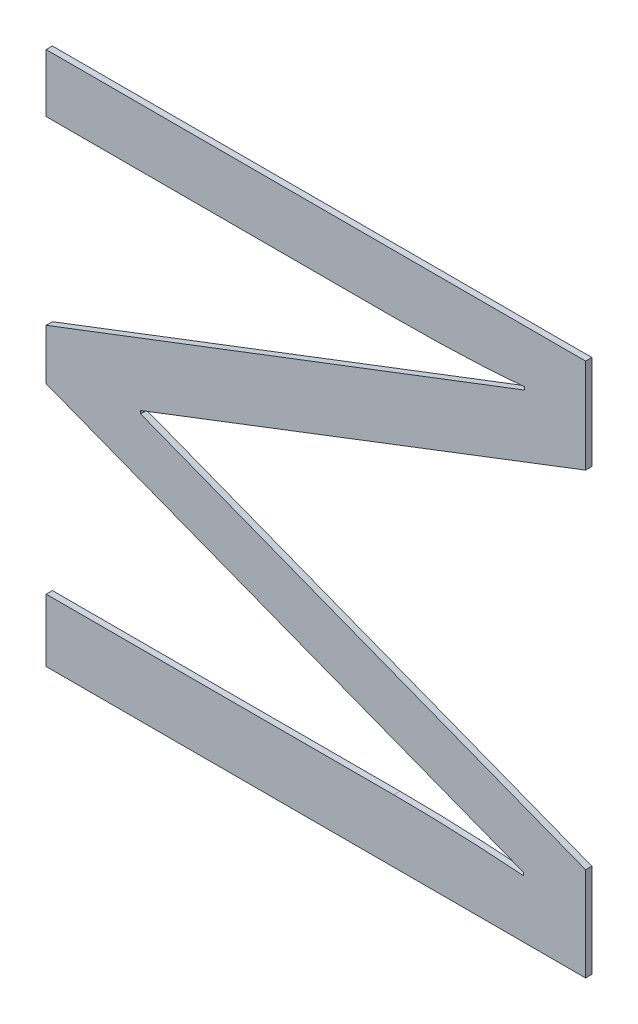
ISO-10303-21;
HEADER;
FILE_DESCRIPTION(('STEP AP214'),'2;1');
FILE_NAME('part.step','',(''),(''),'','','');
FILE_SCHEMA(('AUTOMOTIVE_DESIGN { 1 0 10303 214 1 1 1 1 }'));
ENDSEC;
DATA;
#1=APPLICATION_CONTEXT('core data for automotive mechanical design processes');
#2=APPLICATION_PROTOCOL_DEFINITION('international standard','automotive_design',2000,#1);
#3=PRODUCT_CONTEXT('',#1,'mechanical');
#4=PRODUCT('Part','Part','',(#3));
#5=PRODUCT_RELATED_PRODUCT_CATEGORY('part','',(#4));
#6=PRODUCT_DEFINITION_FORMATION('','',#4);
#7=PRODUCT_DEFINITION_CONTEXT('part definition',#1,'design');
#8=PRODUCT_DEFINITION('design','',#6,#7);
#9=PRODUCT_DEFINITION_SHAPE('','',#8);
#10=(LENGTH_UNIT() NAMED_UNIT(*) SI_UNIT(.MILLI.,.METRE.));
#11=(NAMED_UNIT(*) PLANE_ANGLE_UNIT() SI_UNIT($,.RADIAN.));
#12=(NAMED_UNIT(*) SI_UNIT($,.STERADIAN.) SOLID_ANGLE_UNIT());
#13=UNCERTAINTY_MEASURE_WITH_UNIT(LENGTH_MEASURE(1.E-05),#10,'distance_accuracy_value','');
#14=(GEOMETRIC_REPRESENTATION_CONTEXT(3) GLOBAL_UNCERTAINTY_ASSIGNED_CONTEXT((#13)) GLOBAL_UNIT_ASSIGNED_CONTEXT((#10,
#11,#12)) REPRESENTATION_CONTEXT('',''));
#15=CARTESIAN_POINT('',(0.,0.,0.));
#16=DIRECTION('',(0.,0.,1.));
#17=DIRECTION('',(1.,0.,0.));
#18=AXIS2_PLACEMENT_3D('',#15,#16,#17);
#19=CARTESIAN_POINT('',(32.574920494297,13.734089114766,2.64));
#20=DIRECTION('',(0.,0.,1.));
#21=DIRECTION('',(1.,0.,0.));
#22=AXIS2_PLACEMENT_3D('',#19,#20,#21);
#23=PLANE('',#22);
#24=DIRECTION('',(0.,1.,0.));
#25=VECTOR('',#24,1.);
#26=CARTESIAN_POINT('',(34.374755134521,17.566282985891,2.64));
#27=LINE('',#26,#25);
#28=CARTESIAN_POINT('',(34.374755134521,17.563918171453,2.64));
#29=VERTEX_POINT('',#28);
#30=CARTESIAN_POINT('',(34.374755134521,17.568647800329,2.64));
#31=VERTEX_POINT('',#30);
#32=EDGE_CURVE('E122',#29,#31,#27,.T.);
#33=ORIENTED_EDGE('',*,*,#32,.T.);
#34=CARTESIAN_POINT('',(34.158327317146,17.560323653507,2.64));
#35=CARTESIAN_POINT('',(34.283757074943,17.560323653507,2.64));
#36=CARTESIAN_POINT('',(34.374755134521,17.568647800329,2.64));
#37=B_SPLINE_CURVE_WITH_KNOTS('',2,(#34,#35,#36),.UNSPECIFIED.,.F.,.F.,(3,3),(0.,1.),.UNSPECIFIED.);
#38=CARTESIAN_POINT('',(34.158327317146,17.560323653507,2.64));
#39=VERTEX_POINT('',#38);
#40=EDGE_CURVE('E130',#31,#39,#37,.F.);
#41=ORIENTED_EDGE('',*,*,#40,.T.);
#42=DIRECTION('',(1.,0.,0.));
#43=VECTOR('',#42,1.);
#44=CARTESIAN_POINT('',(33.883441286861,17.560323653507,2.64));
#45=LINE('',#44,#43);
#46=CARTESIAN_POINT('',(33.608555256577,17.560323653507,2.64));
#47=VERTEX_POINT('',#46);
#48=EDGE_CURVE('E147',#39,#47,#45,.F.);
#49=ORIENTED_EDGE('',*,*,#48,.T.);
#50=DIRECTION('',(0.,1.,0.));
#51=VECTOR('',#50,1.);
#52=CARTESIAN_POINT('',(33.608555256577,17.606768609071,2.64));
#53=LINE('',#52,#51);
#54=CARTESIAN_POINT('',(33.608555256577,17.653213564636,2.64));
#55=VERTEX_POINT('',#54);
#56=EDGE_CURVE('E153',#47,#55,#53,.T.);
#57=ORIENTED_EDGE('',*,*,#56,.T.);
#58=DIRECTION('',(1.,0.,0.));
#59=VECTOR('',#58,1.);
#60=CARTESIAN_POINT('',(34.040748743283,17.653213564636,2.64));
#61=LINE('',#60,#59);
#62=CARTESIAN_POINT('',(34.47294222999,17.653213564636,2.64));
#63=VERTEX_POINT('',#62);
#64=EDGE_CURVE('E159',#55,#63,#61,.T.);
#65=ORIENTED_EDGE('',*,*,#64,.T.);
#66=DIRECTION('',(0.,1.,0.));
#67=VECTOR('',#66,1.);
#68=CARTESIAN_POINT('',(34.47294222999,17.577539502617,2.64));
#69=LINE('',#68,#67);
#70=CARTESIAN_POINT('',(34.47294222999,17.501865440597,2.64));
#71=VERTEX_POINT('',#70);
#72=EDGE_CURVE('E165',#63,#71,#69,.F.);
#73=ORIENTED_EDGE('',*,*,#72,.T.);
#74=DIRECTION('',(-0.933562487920853,-0.358414677638943,0.));
#75=VECTOR('',#74,1.);
#76=CARTESIAN_POINT('',(34.116422805303,17.36498998092,2.64));
#77=LINE('',#76,#75);
#78=CARTESIAN_POINT('',(33.7599033806151,17.2281145212428,2.64));
#79=VERTEX_POINT('',#78);
#80=EDGE_CURVE('E171',#71,#79,#77,.T.);
#81=ORIENTED_EDGE('',*,*,#80,.T.);
#82=DIRECTION('',(0.,1.,0.));
#83=VECTOR('',#82,1.);
#84=CARTESIAN_POINT('',(33.759903380615,17.225749706805,2.64));
#85=LINE('',#84,#83);
#86=CARTESIAN_POINT('',(33.7599033806149,17.2233848923669,2.64));
#87=VERTEX_POINT('',#86);
#88=EDGE_CURVE('E177',#79,#87,#85,.F.);
#89=ORIENTED_EDGE('',*,*,#88,.T.);
#90=DIRECTION('',(0.932565411220592,-0.361001044035842,0.));
#91=VECTOR('',#90,1.);
#92=CARTESIAN_POINT('',(34.116422805303,17.085374321759,2.64));
#93=LINE('',#92,#91);
#94=CARTESIAN_POINT('',(34.47294222999,16.9473637511519,2.64));
#95=VERTEX_POINT('',#94);
#96=EDGE_CURVE('E183',#87,#95,#93,.T.);
#97=ORIENTED_EDGE('',*,*,#96,.T.);
#98=DIRECTION('',(0.,1.,0.));
#99=VECTOR('',#98,1.);
#100=CARTESIAN_POINT('',(34.47294222999,16.872257244598,2.64));
#101=LINE('',#100,#99);
#102=CARTESIAN_POINT('',(34.47294222999,16.797150738044,2.64));
#103=VERTEX_POINT('',#102);
#104=EDGE_CURVE('E189',#95,#103,#101,.F.);
#105=ORIENTED_EDGE('',*,*,#104,.T.);
#106=DIRECTION('',(1.,0.,0.));
#107=VECTOR('',#106,1.);
#108=CARTESIAN_POINT('',(34.040748743283,16.797150738044,2.64));
#109=LINE('',#108,#107);
#110=CARTESIAN_POINT('',(33.608555256577,16.797150738044,2.64));
#111=VERTEX_POINT('',#110);
#112=EDGE_CURVE('E195',#103,#111,#109,.F.);
#113=ORIENTED_EDGE('',*,*,#112,.T.);
#114=DIRECTION('',(0.,1.,0.));
#115=VECTOR('',#114,1.);
#116=CARTESIAN_POINT('',(33.608555256577,16.847379396709,2.64));
#117=LINE('',#116,#115);
#118=CARTESIAN_POINT('',(33.608555256577,16.897608055374,2.64));
#119=VERTEX_POINT('',#118);
#120=EDGE_CURVE('E201',#111,#119,#117,.T.);
#121=ORIENTED_EDGE('',*,*,#120,.T.);
#122=DIRECTION('',(1.,0.,0.));
#123=VECTOR('',#122,1.);
#124=CARTESIAN_POINT('',(33.887035804807,16.897608055374,2.64));
#125=LINE('',#124,#123);
#126=CARTESIAN_POINT('',(34.165516353038,16.897608055374,2.64));
#127=VERTEX_POINT('',#126);
#128=EDGE_CURVE('E66',#119,#127,#125,.T.);
#129=ORIENTED_EDGE('',*,*,#128,.T.);
#130=CARTESIAN_POINT('',(34.37362002359,16.889283908552,2.64));
#131=CARTESIAN_POINT('',(34.261244041492,16.897608055374,2.64));
#132=CARTESIAN_POINT('',(34.165516353038,16.897608055374,2.64));
#133=B_SPLINE_CURVE_WITH_KNOTS('',2,(#130,#131,#132),.UNSPECIFIED.,.F.,.F.,(3,3),(0.,1.),.UNSPECIFIED.);
#134=CARTESIAN_POINT('',(34.37362002359,16.889283908552,2.64));
#135=VERTEX_POINT('',#134);
#136=EDGE_CURVE('E72',#127,#135,#133,.F.);
#137=ORIENTED_EDGE('',*,*,#136,.T.);
#138=DIRECTION('',(0.,1.,0.));
#139=VECTOR('',#138,1.);
#140=CARTESIAN_POINT('',(34.37362002359,16.89164872299,2.64));
#141=LINE('',#140,#139);
#142=CARTESIAN_POINT('',(34.37362002359,16.894013537428,2.64));
#143=VERTEX_POINT('',#142);
#144=EDGE_CURVE('E77',#135,#143,#141,.T.);
#145=ORIENTED_EDGE('',*,*,#144,.T.);
#146=DIRECTION('',(-0.932755833182361,0.360508745614139,0.));
#147=VECTOR('',#146,1.);
#148=CARTESIAN_POINT('',(33.991087640083,17.041861736098,2.64));
#149=LINE('',#148,#147);
#150=CARTESIAN_POINT('',(33.6085552565769,17.1897099347676,2.64));
#151=VERTEX_POINT('',#150);
#152=EDGE_CURVE('E95',#143,#151,#149,.T.);
#153=ORIENTED_EDGE('',*,*,#152,.T.);
#154=DIRECTION('',(0.,1.,0.));
#155=VECTOR('',#154,1.);
#156=CARTESIAN_POINT('',(33.608555256577,17.230195557949,2.64));
#157=LINE('',#156,#155);
#158=CARTESIAN_POINT('',(33.608555256577,17.270681181129,2.64));
#159=VERTEX_POINT('',#158);
#160=EDGE_CURVE('E91',#151,#159,#157,.T.);
#161=ORIENTED_EDGE('',*,*,#160,.T.);
#162=DIRECTION('',(0.933938662414743,0.357433315244902,0.));
#163=VECTOR('',#162,1.);
#164=CARTESIAN_POINT('',(33.991655195549,17.417299676291,2.64));
#165=LINE('',#164,#163);
#166=EDGE_CURVE('E93',#159,#29,#165,.T.);
#167=ORIENTED_EDGE('',*,*,#166,.T.);
#168=EDGE_LOOP('',(#33,#41,#49,#57,#65,#73,#81,#89,#97,#105,#113,#121,#129,#137,#145,#153,#161,#167));
#169=FACE_BOUND('',#168,.T.);
#170=ADVANCED_FACE('F17',(#169),#23,.F.);
#171=CARTESIAN_POINT('',(33.991655195549,17.417299676291,2.64));
#172=DIRECTION('',(0.357433315244902,-0.933938662414743,0.));
#173=DIRECTION('',(0.933938662414743,0.357433315244902,0.));
#174=AXIS2_PLACEMENT_3D('',#171,#172,#173);
#175=PLANE('',#174);
#176=DIRECTION('',(0.,0.,-1.));
#177=VECTOR('',#176,1.);
#178=CARTESIAN_POINT('',(34.374755134521,17.563918171453,2.64));
#179=LINE('',#178,#177);
#180=CARTESIAN_POINT('',(34.374755134521,17.563918171453,2.65));
#181=VERTEX_POINT('',#180);
#182=EDGE_CURVE('E106',#181,#29,#179,.T.);
#183=ORIENTED_EDGE('',*,*,#182,.T.);
#184=ORIENTED_EDGE('',*,*,#166,.F.);
#185=DIRECTION('',(0.,0.,-1.));
#186=VECTOR('',#185,1.);
#187=CARTESIAN_POINT('',(33.608555256577,17.270681181129,2.64));
#188=LINE('',#187,#186);
#189=CARTESIAN_POINT('',(33.608555256577,17.270681181129,2.65));
#190=VERTEX_POINT('',#189);
#191=EDGE_CURVE('E100',#159,#190,#188,.F.);
#192=ORIENTED_EDGE('',*,*,#191,.T.);
#193=DIRECTION('',(-0.933938662414761,-0.357433315244855,0.));
#194=VECTOR('',#193,1.);
#195=CARTESIAN_POINT('',(34.374755134521,17.563918171453,2.65));
#196=LINE('',#195,#194);
#197=EDGE_CURVE('E223',#181,#190,#196,.T.);
#198=ORIENTED_EDGE('',*,*,#197,.F.);
#199=EDGE_LOOP('',(#183,#184,#192,#198));
#200=FACE_BOUND('',#199,.T.);
#201=ADVANCED_FACE('F102',(#200),#175,.F.);
#202=CARTESIAN_POINT('',(33.608555256577,17.230195557949,2.64));
#203=DIRECTION('',(1.,0.,0.));
#204=DIRECTION('',(0.,0.,-1.));
#205=AXIS2_PLACEMENT_3D('',#202,#203,#204);
#206=PLANE('',#205);
#207=ORIENTED_EDGE('',*,*,#191,.F.);
#208=ORIENTED_EDGE('',*,*,#160,.F.);
#209=DIRECTION('',(0.,0.,1.));
#210=VECTOR('',#209,1.);
#211=CARTESIAN_POINT('',(33.6085552565769,17.1897099347676,2.64));
#212=LINE('',#211,#210);
#213=CARTESIAN_POINT('',(33.6085552565769,17.1897099347679,2.65));
#214=VERTEX_POINT('',#213);
#215=EDGE_CURVE('E114',#151,#214,#212,.T.);
#216=ORIENTED_EDGE('',*,*,#215,.T.);
#217=DIRECTION('',(0.,1.,0.));
#218=VECTOR('',#217,1.);
#219=CARTESIAN_POINT('',(33.608555256577,13.734089114766,2.65));
#220=LINE('',#219,#218);
#221=EDGE_CURVE('E111',#190,#214,#220,.F.);
#222=ORIENTED_EDGE('',*,*,#221,.F.);
#223=EDGE_LOOP('',(#207,#208,#216,#222));
#224=FACE_BOUND('',#223,.T.);
#225=ADVANCED_FACE('F109',(#224),#206,.F.);
#226=CARTESIAN_POINT('',(33.991087640083,17.041861736098,2.64));
#227=DIRECTION('',(0.360508745614139,0.932755833182361,0.));
#228=DIRECTION('',(-0.932755833182361,0.360508745614139,0.));
#229=AXIS2_PLACEMENT_3D('',#226,#227,#228);
#230=PLANE('',#229);
#231=ORIENTED_EDGE('',*,*,#215,.F.);
#232=ORIENTED_EDGE('',*,*,#152,.F.);
#233=DIRECTION('',(0.,0.,-1.));
#234=VECTOR('',#233,1.);
#235=CARTESIAN_POINT('',(34.37362002359,16.894013537428,2.64));
#236=LINE('',#235,#234);
#237=CARTESIAN_POINT('',(34.37362002359,16.894013537428,2.65));
#238=VERTEX_POINT('',#237);
#239=EDGE_CURVE('E129',#143,#238,#236,.F.);
#240=ORIENTED_EDGE('',*,*,#239,.T.);
#241=DIRECTION('',(0.932755833182155,-0.360508745614671,0.));
#242=VECTOR('',#241,1.);
#243=CARTESIAN_POINT('',(33.608555256577,17.189709934768,2.65));
#244=LINE('',#243,#242);
#245=EDGE_CURVE('E222',#214,#238,#244,.T.);
#246=ORIENTED_EDGE('',*,*,#245,.F.);
#247=EDGE_LOOP('',(#231,#232,#240,#246));
#248=FACE_BOUND('',#247,.T.);
#249=ADVANCED_FACE('F395',(#248),#230,.F.);
#250=CARTESIAN_POINT('',(34.37362002359,16.89164872299,2.64));
#251=DIRECTION('',(1.,0.,0.));
#252=DIRECTION('',(0.,0.,-1.));
#253=AXIS2_PLACEMENT_3D('',#250,#251,#252);
#254=PLANE('',#253);
#255=ORIENTED_EDGE('',*,*,#239,.F.);
#256=ORIENTED_EDGE('',*,*,#144,.F.);
#257=DIRECTION('',(0.,0.,1.));
#258=VECTOR('',#257,1.);
#259=CARTESIAN_POINT('',(34.37362002359,16.889283908552,2.64));
#260=LINE('',#259,#258);
#261=CARTESIAN_POINT('',(34.37362002359,16.889283908552,2.65));
#262=VERTEX_POINT('',#261);
#263=EDGE_CURVE('E128',#135,#262,#260,.T.);
#264=ORIENTED_EDGE('',*,*,#263,.T.);
#265=DIRECTION('',(0.,1.,0.));
#266=VECTOR('',#265,1.);
#267=CARTESIAN_POINT('',(34.37362002359,13.734089114766,2.65));
#268=LINE('',#267,#266);
#269=EDGE_CURVE('E226',#238,#262,#268,.F.);
#270=ORIENTED_EDGE('',*,*,#269,.F.);
#271=EDGE_LOOP('',(#255,#256,#264,#270));
#272=FACE_BOUND('',#271,.T.);
#273=ADVANCED_FACE('F298',(#272),#254,.F.);
#274=CARTESIAN_POINT('',(34.165516353038,16.897608055374,2.64));
#275=CARTESIAN_POINT('',(34.261244041492,16.897608055374,2.64));
#276=CARTESIAN_POINT('',(34.37362002359,16.889283908552,2.64));
#277=(BOUNDED_CURVE() B_SPLINE_CURVE(2,(#274,#275,#276),.UNSPECIFIED.,.F.,
.F.) B_SPLINE_CURVE_WITH_KNOTS((3,3),(0.,1.),
.UNSPECIFIED.) CURVE() GEOMETRIC_REPRESENTATION_ITEM() RATIONAL_B_SPLINE_CURVE((1.,1.,1.)) REPRESENTATION_ITEM(''));
#278=DIRECTION('',(0.,0.,1.));
#279=VECTOR('',#278,1.);
#280=SURFACE_OF_LINEAR_EXTRUSION('',#277,#279);
#281=ORIENTED_EDGE('',*,*,#263,.F.);
#282=ORIENTED_EDGE('',*,*,#136,.F.);
#283=DIRECTION('',(0.,0.,-1.));
#284=VECTOR('',#283,1.);
#285=CARTESIAN_POINT('',(34.165516353038,16.897608055374,2.64));
#286=LINE('',#285,#284);
#287=CARTESIAN_POINT('',(34.165516353038,16.897608055374,2.65));
#288=VERTEX_POINT('',#287);
#289=EDGE_CURVE('E203',#127,#288,#286,.F.);
#290=ORIENTED_EDGE('',*,*,#289,.T.);
#291=CARTESIAN_POINT('',(34.37362002359,16.889283908552,2.65));
#292=CARTESIAN_POINT('',(34.261244041492,16.897608055374,2.65));
#293=CARTESIAN_POINT('',(34.165516353038,16.897608055374,2.65));
#294=B_SPLINE_CURVE_WITH_KNOTS('',2,(#291,#292,#293),.UNSPECIFIED.,.F.,.F.,(3,3),(0.,1.),.UNSPECIFIED.);
#295=EDGE_CURVE('E319',#262,#288,#294,.T.);
#296=ORIENTED_EDGE('',*,*,#295,.F.);
#297=EDGE_LOOP('',(#281,#282,#290,#296));
#298=FACE_BOUND('',#297,.T.);
#299=ADVANCED_FACE('F293',(#298),#280,.F.);
#300=CARTESIAN_POINT('',(33.887035804807,16.897608055374,2.64));
#301=DIRECTION('',(0.,-1.,0.));
#302=DIRECTION('',(0.,0.,-1.));
#303=AXIS2_PLACEMENT_3D('',#300,#301,#302);
#304=PLANE('',#303);
#305=ORIENTED_EDGE('',*,*,#289,.F.);
#306=ORIENTED_EDGE('',*,*,#128,.F.);
#307=DIRECTION('',(0.,0.,-1.));
#308=VECTOR('',#307,1.);
#309=CARTESIAN_POINT('',(33.608555256577,16.897608055374,2.64));
#310=LINE('',#309,#308);
#311=CARTESIAN_POINT('',(33.608555256577,16.897608055374,2.65));
#312=VERTEX_POINT('',#311);
#313=EDGE_CURVE('E198',#119,#312,#310,.F.);
#314=ORIENTED_EDGE('',*,*,#313,.T.);
#315=DIRECTION('',(1.,0.,0.));
#316=VECTOR('',#315,1.);
#317=CARTESIAN_POINT('',(32.574920494297,16.897608055374,2.65));
#318=LINE('',#317,#316);
#319=EDGE_CURVE('E323',#288,#312,#318,.F.);
#320=ORIENTED_EDGE('',*,*,#319,.F.);
#321=EDGE_LOOP('',(#305,#306,#314,#320));
#322=FACE_BOUND('',#321,.T.);
#323=ADVANCED_FACE('F289',(#322),#304,.F.);
#324=CARTESIAN_POINT('',(33.608555256577,16.847379396709,2.64));
#325=DIRECTION('',(1.,0.,0.));
#326=DIRECTION('',(0.,0.,-1.));
#327=AXIS2_PLACEMENT_3D('',#324,#325,#326);
#328=PLANE('',#327);
#329=ORIENTED_EDGE('',*,*,#313,.F.);
#330=ORIENTED_EDGE('',*,*,#120,.F.);
#331=DIRECTION('',(0.,0.,1.));
#332=VECTOR('',#331,1.);
#333=CARTESIAN_POINT('',(33.608555256577,16.797150738044,2.64));
#334=LINE('',#333,#332);
#335=CARTESIAN_POINT('',(33.608555256577,16.797150738044,2.65));
#336=VERTEX_POINT('',#335);
#337=EDGE_CURVE('E192',#111,#336,#334,.T.);
#338=ORIENTED_EDGE('',*,*,#337,.T.);
#339=DIRECTION('',(0.,1.,0.));
#340=VECTOR('',#339,1.);
#341=CARTESIAN_POINT('',(33.608555256577,13.734089114766,2.65));
#342=LINE('',#341,#340);
#343=EDGE_CURVE('E351',#312,#336,#342,.F.);
#344=ORIENTED_EDGE('',*,*,#343,.F.);
#345=EDGE_LOOP('',(#329,#330,#338,#344));
#346=FACE_BOUND('',#345,.T.);
#347=ADVANCED_FACE('F285',(#346),#328,.F.);
#348=CARTESIAN_POINT('',(34.040748743283,16.797150738044,2.64));
#349=DIRECTION('',(0.,1.,0.));
#350=DIRECTION('',(0.,0.,1.));
#351=AXIS2_PLACEMENT_3D('',#348,#349,#350);
#352=PLANE('',#351);
#353=ORIENTED_EDGE('',*,*,#337,.F.);
#354=ORIENTED_EDGE('',*,*,#112,.F.);
#355=DIRECTION('',(0.,0.,1.));
#356=VECTOR('',#355,1.);
#357=CARTESIAN_POINT('',(34.47294222999,16.797150738044,2.64));
#358=LINE('',#357,#356);
#359=CARTESIAN_POINT('',(34.47294222999,16.797150738044,2.65));
#360=VERTEX_POINT('',#359);
#361=EDGE_CURVE('E186',#103,#360,#358,.T.);
#362=ORIENTED_EDGE('',*,*,#361,.T.);
#363=DIRECTION('',(1.,0.,0.));
#364=VECTOR('',#363,1.);
#365=CARTESIAN_POINT('',(32.574920494297,16.797150738044,2.65));
#366=LINE('',#365,#364);
#367=EDGE_CURVE('E353',#336,#360,#366,.T.);
#368=ORIENTED_EDGE('',*,*,#367,.F.);
#369=EDGE_LOOP('',(#353,#354,#362,#368));
#370=FACE_BOUND('',#369,.T.);
#371=ADVANCED_FACE('F281',(#370),#352,.F.);
#372=CARTESIAN_POINT('',(34.47294222999,16.872257244598,2.64));
#373=DIRECTION('',(-1.,0.,0.));
#374=DIRECTION('',(0.,0.,1.));
#375=AXIS2_PLACEMENT_3D('',#372,#373,#374);
#376=PLANE('',#375);
#377=ORIENTED_EDGE('',*,*,#361,.F.);
#378=ORIENTED_EDGE('',*,*,#104,.F.);
#379=DIRECTION('',(0.,0.,1.));
#380=VECTOR('',#379,1.);
#381=CARTESIAN_POINT('',(34.4729422299899,16.9473637511519,2.64));
#382=LINE('',#381,#380);
#383=CARTESIAN_POINT('',(34.47294222999,16.947363751152,2.65));
#384=VERTEX_POINT('',#383);
#385=EDGE_CURVE('E180',#95,#384,#382,.T.);
#386=ORIENTED_EDGE('',*,*,#385,.T.);
#387=DIRECTION('',(0.,1.,0.));
#388=VECTOR('',#387,1.);
#389=CARTESIAN_POINT('',(34.47294222999,13.734089114766,2.65));
#390=LINE('',#389,#388);
#391=EDGE_CURVE('E358',#360,#384,#390,.T.);
#392=ORIENTED_EDGE('',*,*,#391,.F.);
#393=EDGE_LOOP('',(#377,#378,#386,#392));
#394=FACE_BOUND('',#393,.T.);
#395=ADVANCED_FACE('F277',(#394),#376,.F.);
#396=CARTESIAN_POINT('',(34.116422805303,17.085374321759,2.64));
#397=DIRECTION('',(-0.361001044035842,-0.932565411220592,0.));
#398=DIRECTION('',(0.932565411220592,-0.361001044035842,0.));
#399=AXIS2_PLACEMENT_3D('',#396,#397,#398);
#400=PLANE('',#399);
#401=ORIENTED_EDGE('',*,*,#385,.F.);
#402=ORIENTED_EDGE('',*,*,#96,.F.);
#403=DIRECTION('',(0.,0.,1.));
#404=VECTOR('',#403,1.);
#405=CARTESIAN_POINT('',(33.759903380615,17.223384892367,2.64));
#406=LINE('',#405,#404);
#407=CARTESIAN_POINT('',(33.759903380615,17.223384892367,2.65));
#408=VERTEX_POINT('',#407);
#409=EDGE_CURVE('E174',#87,#408,#406,.T.);
#410=ORIENTED_EDGE('',*,*,#409,.T.);
#411=DIRECTION('',(-0.932565411220473,0.36100104403615,0.));
#412=VECTOR('',#411,1.);
#413=CARTESIAN_POINT('',(34.47294222999,16.947363751152,2.65));
#414=LINE('',#413,#412);
#415=EDGE_CURVE('E468',#384,#408,#414,.T.);
#416=ORIENTED_EDGE('',*,*,#415,.F.);
#417=EDGE_LOOP('',(#401,#402,#410,#416));
#418=FACE_BOUND('',#417,.T.);
#419=ADVANCED_FACE('F273',(#418),#400,.F.);
#420=CARTESIAN_POINT('',(33.759903380615,17.225749706805,2.64));
#421=DIRECTION('',(-1.,0.,0.));
#422=DIRECTION('',(0.,0.,1.));
#423=AXIS2_PLACEMENT_3D('',#420,#421,#422);
#424=PLANE('',#423);
#425=ORIENTED_EDGE('',*,*,#409,.F.);
#426=ORIENTED_EDGE('',*,*,#88,.F.);
#427=DIRECTION('',(0.,0.,1.));
#428=VECTOR('',#427,1.);
#429=CARTESIAN_POINT('',(33.7599033806151,17.2281145212428,2.64));
#430=LINE('',#429,#428);
#431=CARTESIAN_POINT('',(33.759903380615,17.2281145212429,2.65));
#432=VERTEX_POINT('',#431);
#433=EDGE_CURVE('E168',#79,#432,#430,.T.);
#434=ORIENTED_EDGE('',*,*,#433,.T.);
#435=DIRECTION('',(0.,1.,0.));
#436=VECTOR('',#435,1.);
#437=CARTESIAN_POINT('',(33.759903380615,13.734089114766,2.65));
#438=LINE('',#437,#436);
#439=EDGE_CURVE('E460',#408,#432,#438,.T.);
#440=ORIENTED_EDGE('',*,*,#439,.F.);
#441=EDGE_LOOP('',(#425,#426,#434,#440));
#442=FACE_BOUND('',#441,.T.);
#443=ADVANCED_FACE('F269',(#442),#424,.F.);
#444=CARTESIAN_POINT('',(34.116422805303,17.36498998092,2.64));
#445=DIRECTION('',(-0.358414677638943,0.933562487920853,0.));
#446=DIRECTION('',(-0.933562487920853,-0.358414677638943,0.));
#447=AXIS2_PLACEMENT_3D('',#444,#445,#446);
#448=PLANE('',#447);
#449=ORIENTED_EDGE('',*,*,#433,.F.);
#450=ORIENTED_EDGE('',*,*,#80,.F.);
#451=DIRECTION('',(0.,0.,1.));
#452=VECTOR('',#451,1.);
#453=CARTESIAN_POINT('',(34.47294222999,17.501865440597,2.64));
#454=LINE('',#453,#452);
#455=CARTESIAN_POINT('',(34.47294222999,17.501865440597,2.65));
#456=VERTEX_POINT('',#455);
#457=EDGE_CURVE('E162',#71,#456,#454,.T.);
#458=ORIENTED_EDGE('',*,*,#457,.T.);
#459=DIRECTION('',(0.933562487920872,0.358414677638894,0.));
#460=VECTOR('',#459,1.);
#461=CARTESIAN_POINT('',(33.759903380615,17.228114521243,2.65));
#462=LINE('',#461,#460);
#463=EDGE_CURVE('E485',#432,#456,#462,.T.);
#464=ORIENTED_EDGE('',*,*,#463,.F.);
#465=EDGE_LOOP('',(#449,#450,#458,#464));
#466=FACE_BOUND('',#465,.T.);
#467=ADVANCED_FACE('F265',(#466),#448,.F.);
#468=CARTESIAN_POINT('',(34.47294222999,17.577539502617,2.64));
#469=DIRECTION('',(-1.,0.,0.));
#470=DIRECTION('',(0.,0.,1.));
#471=AXIS2_PLACEMENT_3D('',#468,#469,#470);
#472=PLANE('',#471);
#473=ORIENTED_EDGE('',*,*,#457,.F.);
#474=ORIENTED_EDGE('',*,*,#72,.F.);
#475=DIRECTION('',(0.,0.,-1.));
#476=VECTOR('',#475,1.);
#477=CARTESIAN_POINT('',(34.47294222999,17.653213564636,2.64));
#478=LINE('',#477,#476);
#479=CARTESIAN_POINT('',(34.47294222999,17.653213564636,2.65));
#480=VERTEX_POINT('',#479);
#481=EDGE_CURVE('E156',#63,#480,#478,.F.);
#482=ORIENTED_EDGE('',*,*,#481,.T.);
#483=DIRECTION('',(0.,1.,0.));
#484=VECTOR('',#483,1.);
#485=CARTESIAN_POINT('',(34.47294222999,13.734089114766,2.65));
#486=LINE('',#485,#484);
#487=EDGE_CURVE('E486',#456,#480,#486,.T.);
#488=ORIENTED_EDGE('',*,*,#487,.F.);
#489=EDGE_LOOP('',(#473,#474,#482,#488));
#490=FACE_BOUND('',#489,.T.);
#491=ADVANCED_FACE('F261',(#490),#472,.F.);
#492=CARTESIAN_POINT('',(34.040748743283,17.653213564636,2.64));
#493=DIRECTION('',(0.,-1.,0.));
#494=DIRECTION('',(0.,0.,-1.));
#495=AXIS2_PLACEMENT_3D('',#492,#493,#494);
#496=PLANE('',#495);
#497=ORIENTED_EDGE('',*,*,#481,.F.);
#498=ORIENTED_EDGE('',*,*,#64,.F.);
#499=DIRECTION('',(0.,0.,-1.));
#500=VECTOR('',#499,1.);
#501=CARTESIAN_POINT('',(33.608555256577,17.653213564636,2.64));
#502=LINE('',#501,#500);
#503=CARTESIAN_POINT('',(33.608555256577,17.653213564636,2.65));
#504=VERTEX_POINT('',#503);
#505=EDGE_CURVE('E150',#55,#504,#502,.F.);
#506=ORIENTED_EDGE('',*,*,#505,.T.);
#507=DIRECTION('',(1.,0.,0.));
#508=VECTOR('',#507,1.);
#509=CARTESIAN_POINT('',(32.574920494297,17.653213564636,2.65));
#510=LINE('',#509,#508);
#511=EDGE_CURVE('E345',#480,#504,#510,.F.);
#512=ORIENTED_EDGE('',*,*,#511,.F.);
#513=EDGE_LOOP('',(#497,#498,#506,#512));
#514=FACE_BOUND('',#513,.T.);
#515=ADVANCED_FACE('F257',(#514),#496,.F.);
#516=CARTESIAN_POINT('',(33.608555256577,17.606768609071,2.64));
#517=DIRECTION('',(1.,0.,0.));
#518=DIRECTION('',(0.,0.,-1.));
#519=AXIS2_PLACEMENT_3D('',#516,#517,#518);
#520=PLANE('',#519);
#521=ORIENTED_EDGE('',*,*,#505,.F.);
#522=ORIENTED_EDGE('',*,*,#56,.F.);
#523=DIRECTION('',(0.,0.,1.));
#524=VECTOR('',#523,1.);
#525=CARTESIAN_POINT('',(33.608555256577,17.560323653507,2.64));
#526=LINE('',#525,#524);
#527=CARTESIAN_POINT('',(33.608555256577,17.560323653507,2.65));
#528=VERTEX_POINT('',#527);
#529=EDGE_CURVE('E138',#47,#528,#526,.T.);
#530=ORIENTED_EDGE('',*,*,#529,.T.);
#531=DIRECTION('',(0.,1.,0.));
#532=VECTOR('',#531,1.);
#533=CARTESIAN_POINT('',(33.608555256577,13.734089114766,2.65));
#534=LINE('',#533,#532);
#535=EDGE_CURVE('E343',#504,#528,#534,.F.);
#536=ORIENTED_EDGE('',*,*,#535,.F.);
#537=EDGE_LOOP('',(#521,#522,#530,#536));
#538=FACE_BOUND('',#537,.T.);
#539=ADVANCED_FACE('F253',(#538),#520,.F.);
#540=CARTESIAN_POINT('',(33.883441286861,17.560323653507,2.64));
#541=DIRECTION('',(0.,1.,0.));
#542=DIRECTION('',(0.,0.,1.));
#543=AXIS2_PLACEMENT_3D('',#540,#541,#542);
#544=PLANE('',#543);
#545=ORIENTED_EDGE('',*,*,#529,.F.);
#546=ORIENTED_EDGE('',*,*,#48,.F.);
#547=DIRECTION('',(0.,0.,1.));
#548=VECTOR('',#547,1.);
#549=CARTESIAN_POINT('',(34.158327317146,17.560323653507,2.64));
#550=LINE('',#549,#548);
#551=CARTESIAN_POINT('',(34.158327317146,17.560323653507,2.65));
#552=VERTEX_POINT('',#551);
#553=EDGE_CURVE('E137',#39,#552,#550,.T.);
#554=ORIENTED_EDGE('',*,*,#553,.T.);
#555=DIRECTION('',(1.,0.,0.));
#556=VECTOR('',#555,1.);
#557=CARTESIAN_POINT('',(32.574920494297,17.560323653507,2.65));
#558=LINE('',#557,#556);
#559=EDGE_CURVE('E338',#528,#552,#558,.T.);
#560=ORIENTED_EDGE('',*,*,#559,.F.);
#561=EDGE_LOOP('',(#545,#546,#554,#560));
#562=FACE_BOUND('',#561,.T.);
#563=ADVANCED_FACE('F249',(#562),#544,.F.);
#564=CARTESIAN_POINT('',(34.374755134521,17.568647800329,2.64));
#565=CARTESIAN_POINT('',(34.283757074943,17.560323653507,2.64));
#566=CARTESIAN_POINT('',(34.158327317146,17.560323653507,2.64));
#567=(BOUNDED_CURVE() B_SPLINE_CURVE(2,(#564,#565,#566),.UNSPECIFIED.,.F.,
.F.) B_SPLINE_CURVE_WITH_KNOTS((3,3),(0.,1.),
.UNSPECIFIED.) CURVE() GEOMETRIC_REPRESENTATION_ITEM() RATIONAL_B_SPLINE_CURVE((1.,1.,1.)) REPRESENTATION_ITEM(''));
#568=DIRECTION('',(0.,0.,1.));
#569=VECTOR('',#568,1.);
#570=SURFACE_OF_LINEAR_EXTRUSION('',#567,#569);
#571=ORIENTED_EDGE('',*,*,#553,.F.);
#572=ORIENTED_EDGE('',*,*,#40,.F.);
#573=DIRECTION('',(0.,0.,-1.));
#574=VECTOR('',#573,1.);
#575=CARTESIAN_POINT('',(34.374755134521,17.568647800329,2.64));
#576=LINE('',#575,#574);
#577=CARTESIAN_POINT('',(34.374755134521,17.568647800329,2.65));
#578=VERTEX_POINT('',#577);
#579=EDGE_CURVE('E36',#31,#578,#576,.F.);
#580=ORIENTED_EDGE('',*,*,#579,.T.);
#581=CARTESIAN_POINT('',(34.158327317146,17.560323653507,2.65));
#582=CARTESIAN_POINT('',(34.283757074943,17.560323653507,2.65));
#583=CARTESIAN_POINT('',(34.374755134521,17.568647800329,2.65));
#584=B_SPLINE_CURVE_WITH_KNOTS('',2,(#581,#582,#583),.UNSPECIFIED.,.F.,.F.,(3,3),(0.,1.),.UNSPECIFIED.);
#585=EDGE_CURVE('E27',#552,#578,#584,.T.);
#586=ORIENTED_EDGE('',*,*,#585,.F.);
#587=EDGE_LOOP('',(#571,#572,#580,#586));
#588=FACE_BOUND('',#587,.T.);
#589=ADVANCED_FACE('F244',(#588),#570,.F.);
#590=CARTESIAN_POINT('',(34.374755134521,17.566282985891,2.64));
#591=DIRECTION('',(1.,0.,0.));
#592=DIRECTION('',(0.,0.,-1.));
#593=AXIS2_PLACEMENT_3D('',#590,#591,#592);
#594=PLANE('',#593);
#595=ORIENTED_EDGE('',*,*,#579,.F.);
#596=ORIENTED_EDGE('',*,*,#32,.F.);
#597=ORIENTED_EDGE('',*,*,#182,.F.);
#598=DIRECTION('',(0.,1.,0.));
#599=VECTOR('',#598,1.);
#600=CARTESIAN_POINT('',(34.374755134521,13.734089114766,2.65));
#601=LINE('',#600,#599);
#602=EDGE_CURVE('E11',#578,#181,#601,.F.);
#603=ORIENTED_EDGE('',*,*,#602,.F.);
#604=EDGE_LOOP('',(#595,#596,#597,#603));
#605=FACE_BOUND('',#604,.T.);
#606=ADVANCED_FACE('F248',(#605),#594,.F.);
#607=CARTESIAN_POINT('',(32.574920494297,13.734089114766,2.65));
#608=DIRECTION('',(0.,0.,1.));
#609=DIRECTION('',(1.,0.,0.));
#610=AXIS2_PLACEMENT_3D('',#607,#608,#609);
#611=PLANE('',#610);
#612=ORIENTED_EDGE('',*,*,#585,.T.);
#613=ORIENTED_EDGE('',*,*,#602,.T.);
#614=ORIENTED_EDGE('',*,*,#197,.T.);
#615=ORIENTED_EDGE('',*,*,#221,.T.);
#616=ORIENTED_EDGE('',*,*,#245,.T.);
#617=ORIENTED_EDGE('',*,*,#269,.T.);
#618=ORIENTED_EDGE('',*,*,#295,.T.);
#619=ORIENTED_EDGE('',*,*,#319,.T.);
#620=ORIENTED_EDGE('',*,*,#343,.T.);
#621=ORIENTED_EDGE('',*,*,#367,.T.);
#622=ORIENTED_EDGE('',*,*,#391,.T.);
#623=ORIENTED_EDGE('',*,*,#415,.T.);
#624=ORIENTED_EDGE('',*,*,#439,.T.);
#625=ORIENTED_EDGE('',*,*,#463,.T.);
#626=ORIENTED_EDGE('',*,*,#487,.T.);
#627=ORIENTED_EDGE('',*,*,#511,.T.);
#628=ORIENTED_EDGE('',*,*,#535,.T.);
#629=ORIENTED_EDGE('',*,*,#559,.T.);
#630=EDGE_LOOP('',(#612,#613,#614,#615,#616,#617,#618,#619,#620,#621,#622,#623,#624,#625,#626,
#627,#628,#629));
#631=FACE_BOUND('',#630,.T.);
#632=ADVANCED_FACE('F326',(#631),#611,.T.);
#633=CLOSED_SHELL('',(#170,#201,#225,#249,#273,#299,#323,#347,#371,#395,#419,#443,#467,#491,
#515,#539,#563,#589,#606,#632));
#634=MANIFOLD_SOLID_BREP('B1',#633);
#635=ADVANCED_BREP_SHAPE_REPRESENTATION('',(#18,#634),#14);
#636=SHAPE_DEFINITION_REPRESENTATION(#9,#635);
ENDSEC;
END-ISO-10303-21;
